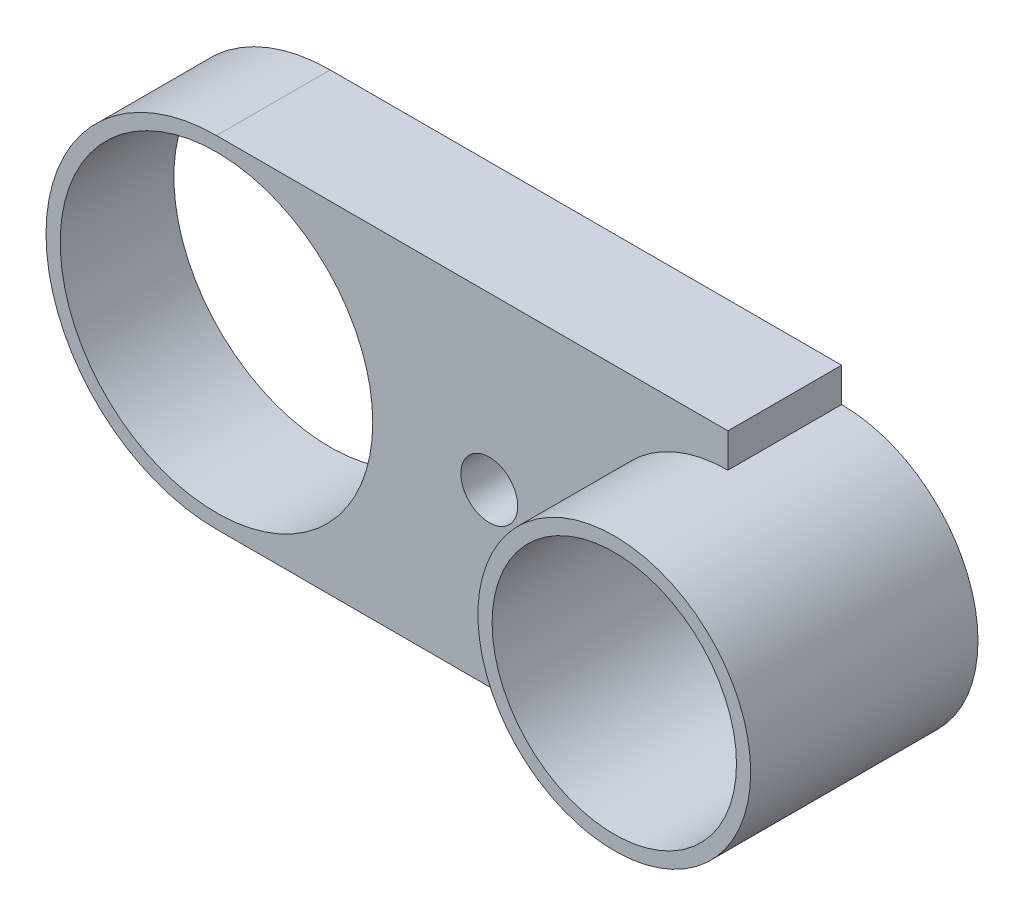
ISO-10303-21;
HEADER;
FILE_DESCRIPTION(('STEP AP214'),'2;1');
FILE_NAME('part.step','',(''),(''),'','','');
FILE_SCHEMA(('AUTOMOTIVE_DESIGN { 1 0 10303 214 1 1 1 1 }'));
ENDSEC;
DATA;
#1=APPLICATION_CONTEXT('core data for automotive mechanical design processes');
#2=APPLICATION_PROTOCOL_DEFINITION('international standard','automotive_design',2000,#1);
#3=PRODUCT_CONTEXT('',#1,'mechanical');
#4=PRODUCT('Part','Part','',(#3));
#5=PRODUCT_RELATED_PRODUCT_CATEGORY('part','',(#4));
#6=PRODUCT_DEFINITION_FORMATION('','',#4);
#7=PRODUCT_DEFINITION_CONTEXT('part definition',#1,'design');
#8=PRODUCT_DEFINITION('design','',#6,#7);
#9=PRODUCT_DEFINITION_SHAPE('','',#8);
#10=(LENGTH_UNIT() NAMED_UNIT(*) SI_UNIT(.MILLI.,.METRE.));
#11=(NAMED_UNIT(*) PLANE_ANGLE_UNIT() SI_UNIT($,.RADIAN.));
#12=(NAMED_UNIT(*) SI_UNIT($,.STERADIAN.) SOLID_ANGLE_UNIT());
#13=UNCERTAINTY_MEASURE_WITH_UNIT(LENGTH_MEASURE(1.E-05),#10,'distance_accuracy_value','');
#14=(GEOMETRIC_REPRESENTATION_CONTEXT(3) GLOBAL_UNCERTAINTY_ASSIGNED_CONTEXT((#13)) GLOBAL_UNIT_ASSIGNED_CONTEXT((#10,
#11,#12)) REPRESENTATION_CONTEXT('',''));
#15=CARTESIAN_POINT('',(0.,0.,0.));
#16=DIRECTION('',(0.,0.,1.));
#17=DIRECTION('',(1.,0.,0.));
#18=AXIS2_PLACEMENT_3D('',#15,#16,#17);
#19=CARTESIAN_POINT('',(0.,0.,20.));
#20=DIRECTION('',(0.,0.,-1.));
#21=DIRECTION('',(-1.,0.,0.));
#22=AXIS2_PLACEMENT_3D('',#19,#20,#21);
#23=CYLINDRICAL_SURFACE('',#22,30.);
#24=CARTESIAN_POINT('',(0.,0.,20.));
#25=DIRECTION('',(0.,0.,1.));
#26=DIRECTION('',(1.,0.,0.));
#27=AXIS2_PLACEMENT_3D('',#24,#25,#26);
#28=CIRCLE('',#27,30.);
#29=CARTESIAN_POINT('',(0.,30.,20.));
#30=VERTEX_POINT('',#29);
#31=CARTESIAN_POINT('',(0.,-30.,20.));
#32=VERTEX_POINT('',#31);
#33=EDGE_CURVE('E11',#30,#32,#28,.T.);
#34=ORIENTED_EDGE('',*,*,#33,.F.);
#35=DIRECTION('',(0.,0.,1.));
#36=VECTOR('',#35,1.);
#37=CARTESIAN_POINT('',(0.,30.,0.));
#38=LINE('',#37,#36);
#39=CARTESIAN_POINT('',(0.,30.,0.));
#40=VERTEX_POINT('',#39);
#41=EDGE_CURVE('E143',#40,#30,#38,.T.);
#42=ORIENTED_EDGE('',*,*,#41,.F.);
#43=CARTESIAN_POINT('',(0.,0.,0.));
#44=DIRECTION('',(0.,0.,1.));
#45=DIRECTION('',(1.,0.,0.));
#46=AXIS2_PLACEMENT_3D('',#43,#44,#45);
#47=CIRCLE('',#46,30.);
#48=CARTESIAN_POINT('',(0.,-30.,0.));
#49=VERTEX_POINT('',#48);
#50=EDGE_CURVE('E37',#40,#49,#47,.T.);
#51=ORIENTED_EDGE('',*,*,#50,.T.);
#52=DIRECTION('',(0.,0.,1.));
#53=VECTOR('',#52,1.);
#54=CARTESIAN_POINT('',(0.,-30.,0.));
#55=LINE('',#54,#53);
#56=EDGE_CURVE('E48',#49,#32,#55,.T.);
#57=ORIENTED_EDGE('',*,*,#56,.T.);
#58=EDGE_LOOP('',(#34,#42,#51,#57));
#59=FACE_BOUND('',#58,.T.);
#60=ADVANCED_FACE('F34',(#59),#23,.T.);
#61=CARTESIAN_POINT('',(0.,0.,20.));
#62=DIRECTION('',(0.,0.,1.));
#63=DIRECTION('',(1.,0.,0.));
#64=AXIS2_PLACEMENT_3D('',#61,#62,#63);
#65=PLANE('',#64);
#66=CARTESIAN_POINT('',(90.,0.,20.));
#67=DIRECTION('',(0.,0.,1.));
#68=DIRECTION('',(1.,0.,0.));
#69=AXIS2_PLACEMENT_3D('',#66,#67,#68);
#70=CIRCLE('',#69,24.);
#71=CARTESIAN_POINT('',(90.,24.,20.));
#72=VERTEX_POINT('',#71);
#73=CARTESIAN_POINT('',(90.,-24.,20.));
#74=VERTEX_POINT('',#73);
#75=EDGE_CURVE('E101',#72,#74,#70,.T.);
#76=ORIENTED_EDGE('',*,*,#75,.F.);
#77=DIRECTION('',(0.,1.,0.));
#78=VECTOR('',#77,1.);
#79=CARTESIAN_POINT('',(90.,30.,20.));
#80=LINE('',#79,#78);
#81=CARTESIAN_POINT('',(90.,30.,20.));
#82=VERTEX_POINT('',#81);
#83=EDGE_CURVE('E82',#72,#82,#80,.T.);
#84=ORIENTED_EDGE('',*,*,#83,.T.);
#85=DIRECTION('',(-1.,0.,0.));
#86=VECTOR('',#85,1.);
#87=CARTESIAN_POINT('',(0.,30.,20.));
#88=LINE('',#87,#86);
#89=EDGE_CURVE('E93',#82,#30,#88,.T.);
#90=ORIENTED_EDGE('',*,*,#89,.T.);
#91=ORIENTED_EDGE('',*,*,#33,.T.);
#92=DIRECTION('',(1.,0.,0.));
#93=VECTOR('',#92,1.);
#94=CARTESIAN_POINT('',(0.,-30.,20.));
#95=LINE('',#94,#93);
#96=CARTESIAN_POINT('',(90.,-30.,20.));
#97=VERTEX_POINT('',#96);
#98=EDGE_CURVE('E125',#32,#97,#95,.T.);
#99=ORIENTED_EDGE('',*,*,#98,.T.);
#100=DIRECTION('',(0.,1.,0.));
#101=VECTOR('',#100,1.);
#102=CARTESIAN_POINT('',(90.,-30.,20.));
#103=LINE('',#102,#101);
#104=EDGE_CURVE('E94',#97,#74,#103,.T.);
#105=ORIENTED_EDGE('',*,*,#104,.T.);
#106=EDGE_LOOP('',(#76,#84,#90,#91,#99,#105));
#107=FACE_BOUND('',#106,.T.);
#108=CARTESIAN_POINT('',(48.,0.,20.));
#109=DIRECTION('',(0.,0.,1.));
#110=DIRECTION('',(1.,0.,0.));
#111=AXIS2_PLACEMENT_3D('',#108,#109,#110);
#112=CIRCLE('',#111,5.);
#113=CARTESIAN_POINT('',(53.,0.,20.));
#114=VERTEX_POINT('',#113);
#115=EDGE_CURVE('E115',#114,#114,#112,.T.);
#116=ORIENTED_EDGE('',*,*,#115,.F.);
#117=EDGE_LOOP('',(#116));
#118=FACE_BOUND('',#117,.T.);
#119=CARTESIAN_POINT('',(0.,0.,20.));
#120=DIRECTION('',(0.,0.,1.));
#121=DIRECTION('',(1.,0.,0.));
#122=AXIS2_PLACEMENT_3D('',#119,#120,#121);
#123=CIRCLE('',#122,27.5);
#124=CARTESIAN_POINT('',(27.5,0.,20.));
#125=VERTEX_POINT('',#124);
#126=EDGE_CURVE('E145',#125,#125,#123,.T.);
#127=ORIENTED_EDGE('',*,*,#126,.F.);
#128=EDGE_LOOP('',(#127));
#129=FACE_BOUND('',#128,.T.);
#130=ADVANCED_FACE('F107',(#107,#118,#129),#65,.T.);
#131=CARTESIAN_POINT('',(0.,0.,0.));
#132=DIRECTION('',(0.,0.,1.));
#133=DIRECTION('',(1.,0.,0.));
#134=AXIS2_PLACEMENT_3D('',#131,#132,#133);
#135=PLANE('',#134);
#136=CARTESIAN_POINT('',(48.,0.,0.));
#137=DIRECTION('',(0.,0.,1.));
#138=DIRECTION('',(1.,0.,0.));
#139=AXIS2_PLACEMENT_3D('',#136,#137,#138);
#140=CIRCLE('',#139,5.);
#141=CARTESIAN_POINT('',(53.,0.,0.));
#142=VERTEX_POINT('',#141);
#143=EDGE_CURVE('E122',#142,#142,#140,.T.);
#144=ORIENTED_EDGE('',*,*,#143,.T.);
#145=EDGE_LOOP('',(#144));
#146=FACE_BOUND('',#145,.T.);
#147=CARTESIAN_POINT('',(0.,0.,0.));
#148=DIRECTION('',(0.,0.,1.));
#149=DIRECTION('',(1.,0.,0.));
#150=AXIS2_PLACEMENT_3D('',#147,#148,#149);
#151=CIRCLE('',#150,27.5);
#152=CARTESIAN_POINT('',(27.5,0.,0.));
#153=VERTEX_POINT('',#152);
#154=EDGE_CURVE('E151',#153,#153,#151,.T.);
#155=ORIENTED_EDGE('',*,*,#154,.T.);
#156=EDGE_LOOP('',(#155));
#157=FACE_BOUND('',#156,.T.);
#158=DIRECTION('',(0.,1.,0.));
#159=VECTOR('',#158,1.);
#160=CARTESIAN_POINT('',(90.,30.,0.));
#161=LINE('',#160,#159);
#162=CARTESIAN_POINT('',(90.,24.,0.));
#163=VERTEX_POINT('',#162);
#164=CARTESIAN_POINT('',(90.,30.,0.));
#165=VERTEX_POINT('',#164);
#166=EDGE_CURVE('E135',#163,#165,#161,.T.);
#167=ORIENTED_EDGE('',*,*,#166,.F.);
#168=CARTESIAN_POINT('',(90.,0.,0.));
#169=DIRECTION('',(0.,0.,1.));
#170=DIRECTION('',(1.,0.,0.));
#171=AXIS2_PLACEMENT_3D('',#168,#169,#170);
#172=CIRCLE('',#171,24.);
#173=CARTESIAN_POINT('',(90.,-24.,0.));
#174=VERTEX_POINT('',#173);
#175=EDGE_CURVE('E103',#174,#163,#172,.T.);
#176=ORIENTED_EDGE('',*,*,#175,.F.);
#177=DIRECTION('',(0.,1.,0.));
#178=VECTOR('',#177,1.);
#179=CARTESIAN_POINT('',(90.,-30.,0.));
#180=LINE('',#179,#178);
#181=CARTESIAN_POINT('',(90.,-30.,0.));
#182=VERTEX_POINT('',#181);
#183=EDGE_CURVE('E131',#182,#174,#180,.T.);
#184=ORIENTED_EDGE('',*,*,#183,.F.);
#185=DIRECTION('',(1.,0.,0.));
#186=VECTOR('',#185,1.);
#187=CARTESIAN_POINT('',(0.,-30.,0.));
#188=LINE('',#187,#186);
#189=EDGE_CURVE('E128',#49,#182,#188,.T.);
#190=ORIENTED_EDGE('',*,*,#189,.F.);
#191=ORIENTED_EDGE('',*,*,#50,.F.);
#192=DIRECTION('',(-1.,0.,0.));
#193=VECTOR('',#192,1.);
#194=CARTESIAN_POINT('',(0.,30.,0.));
#195=LINE('',#194,#193);
#196=EDGE_CURVE('E137',#165,#40,#195,.T.);
#197=ORIENTED_EDGE('',*,*,#196,.F.);
#198=EDGE_LOOP('',(#167,#176,#184,#190,#191,#197));
#199=FACE_BOUND('',#198,.T.);
#200=ADVANCED_FACE('F160',(#146,#157,#199),#135,.F.);
#201=CARTESIAN_POINT('',(0.,0.,0.));
#202=DIRECTION('',(0.,0.,1.));
#203=DIRECTION('',(1.,0.,0.));
#204=AXIS2_PLACEMENT_3D('',#201,#202,#203);
#205=CYLINDRICAL_SURFACE('',#204,27.5);
#206=ORIENTED_EDGE('',*,*,#154,.F.);
#207=EDGE_LOOP('',(#206));
#208=FACE_BOUND('',#207,.T.);
#209=ORIENTED_EDGE('',*,*,#126,.T.);
#210=EDGE_LOOP('',(#209));
#211=FACE_BOUND('',#210,.T.);
#212=ADVANCED_FACE('F157',(#208,#211),#205,.F.);
#213=CARTESIAN_POINT('',(0.,30.,0.));
#214=DIRECTION('',(0.,1.,0.));
#215=DIRECTION('',(0.,0.,1.));
#216=AXIS2_PLACEMENT_3D('',#213,#214,#215);
#217=PLANE('',#216);
#218=ORIENTED_EDGE('',*,*,#89,.F.);
#219=DIRECTION('',(0.,0.,1.));
#220=VECTOR('',#219,1.);
#221=CARTESIAN_POINT('',(90.,30.,0.));
#222=LINE('',#221,#220);
#223=EDGE_CURVE('E88',#165,#82,#222,.T.);
#224=ORIENTED_EDGE('',*,*,#223,.F.);
#225=ORIENTED_EDGE('',*,*,#196,.T.);
#226=ORIENTED_EDGE('',*,*,#41,.T.);
#227=EDGE_LOOP('',(#218,#224,#225,#226));
#228=FACE_BOUND('',#227,.T.);
#229=ADVANCED_FACE('F170',(#228),#217,.T.);
#230=CARTESIAN_POINT('',(90.,30.,0.));
#231=DIRECTION('',(1.,0.,0.));
#232=DIRECTION('',(0.,0.,-1.));
#233=AXIS2_PLACEMENT_3D('',#230,#231,#232);
#234=PLANE('',#233);
#235=ORIENTED_EDGE('',*,*,#83,.F.);
#236=DIRECTION('',(0.,0.,1.));
#237=VECTOR('',#236,1.);
#238=CARTESIAN_POINT('',(90.,24.,0.));
#239=LINE('',#238,#237);
#240=EDGE_CURVE('E86',#163,#72,#239,.T.);
#241=ORIENTED_EDGE('',*,*,#240,.F.);
#242=ORIENTED_EDGE('',*,*,#166,.T.);
#243=ORIENTED_EDGE('',*,*,#223,.T.);
#244=EDGE_LOOP('',(#235,#241,#242,#243));
#245=FACE_BOUND('',#244,.T.);
#246=ADVANCED_FACE('F84',(#245),#234,.T.);
#247=CARTESIAN_POINT('',(90.,0.,0.));
#248=DIRECTION('',(0.,0.,1.));
#249=DIRECTION('',(1.,0.,0.));
#250=AXIS2_PLACEMENT_3D('',#247,#248,#249);
#251=CYLINDRICAL_SURFACE('',#250,24.);
#252=ORIENTED_EDGE('',*,*,#240,.T.);
#253=ORIENTED_EDGE('',*,*,#75,.T.);
#254=DIRECTION('',(0.,0.,1.));
#255=VECTOR('',#254,1.);
#256=CARTESIAN_POINT('',(90.,-24.,0.));
#257=LINE('',#256,#255);
#258=EDGE_CURVE('E104',#174,#74,#257,.T.);
#259=ORIENTED_EDGE('',*,*,#258,.F.);
#260=ORIENTED_EDGE('',*,*,#175,.T.);
#261=EDGE_LOOP('',(#252,#253,#259,#260));
#262=FACE_BOUND('',#261,.T.);
#263=CARTESIAN_POINT('',(90.,0.,40.));
#264=DIRECTION('',(0.,0.,1.));
#265=DIRECTION('',(1.,0.,0.));
#266=AXIS2_PLACEMENT_3D('',#263,#264,#265);
#267=CIRCLE('',#266,24.);
#268=CARTESIAN_POINT('',(114.,0.,40.));
#269=VERTEX_POINT('',#268);
#270=EDGE_CURVE('E111',#269,#269,#267,.T.);
#271=ORIENTED_EDGE('',*,*,#270,.F.);
#272=EDGE_LOOP('',(#271));
#273=FACE_BOUND('',#272,.T.);
#274=ADVANCED_FACE('F99',(#262,#273),#251,.T.);
#275=CARTESIAN_POINT('',(90.,-30.,0.));
#276=DIRECTION('',(1.,0.,0.));
#277=DIRECTION('',(0.,0.,-1.));
#278=AXIS2_PLACEMENT_3D('',#275,#276,#277);
#279=PLANE('',#278);
#280=ORIENTED_EDGE('',*,*,#104,.F.);
#281=DIRECTION('',(0.,0.,1.));
#282=VECTOR('',#281,1.);
#283=CARTESIAN_POINT('',(90.,-30.,0.));
#284=LINE('',#283,#282);
#285=EDGE_CURVE('E148',#182,#97,#284,.T.);
#286=ORIENTED_EDGE('',*,*,#285,.F.);
#287=ORIENTED_EDGE('',*,*,#183,.T.);
#288=ORIENTED_EDGE('',*,*,#258,.T.);
#289=EDGE_LOOP('',(#280,#286,#287,#288));
#290=FACE_BOUND('',#289,.T.);
#291=ADVANCED_FACE('F176',(#290),#279,.T.);
#292=CARTESIAN_POINT('',(0.,-30.,0.));
#293=DIRECTION('',(0.,-1.,0.));
#294=DIRECTION('',(0.,0.,-1.));
#295=AXIS2_PLACEMENT_3D('',#292,#293,#294);
#296=PLANE('',#295);
#297=ORIENTED_EDGE('',*,*,#98,.F.);
#298=ORIENTED_EDGE('',*,*,#56,.F.);
#299=ORIENTED_EDGE('',*,*,#189,.T.);
#300=ORIENTED_EDGE('',*,*,#285,.T.);
#301=EDGE_LOOP('',(#297,#298,#299,#300));
#302=FACE_BOUND('',#301,.T.);
#303=ADVANCED_FACE('F172',(#302),#296,.T.);
#304=CARTESIAN_POINT('',(48.,0.,0.));
#305=DIRECTION('',(0.,0.,1.));
#306=DIRECTION('',(1.,0.,0.));
#307=AXIS2_PLACEMENT_3D('',#304,#305,#306);
#308=CYLINDRICAL_SURFACE('',#307,5.);
#309=ORIENTED_EDGE('',*,*,#143,.F.);
#310=EDGE_LOOP('',(#309));
#311=FACE_BOUND('',#310,.T.);
#312=ORIENTED_EDGE('',*,*,#115,.T.);
#313=EDGE_LOOP('',(#312));
#314=FACE_BOUND('',#313,.T.);
#315=ADVANCED_FACE('F175',(#311,#314),#308,.F.);
#316=CARTESIAN_POINT('',(90.,0.,40.));
#317=DIRECTION('',(0.,0.,1.));
#318=DIRECTION('',(1.,0.,0.));
#319=AXIS2_PLACEMENT_3D('',#316,#317,#318);
#320=PLANE('',#319);
#321=CARTESIAN_POINT('',(90.,0.,40.));
#322=DIRECTION('',(0.,0.,1.));
#323=DIRECTION('',(1.,0.,0.));
#324=AXIS2_PLACEMENT_3D('',#321,#322,#323);
#325=CIRCLE('',#324,21.5);
#326=CARTESIAN_POINT('',(111.5,0.,40.));
#327=VERTEX_POINT('',#326);
#328=EDGE_CURVE('E118',#327,#327,#325,.T.);
#329=ORIENTED_EDGE('',*,*,#328,.F.);
#330=EDGE_LOOP('',(#329));
#331=FACE_BOUND('',#330,.T.);
#332=ORIENTED_EDGE('',*,*,#270,.T.);
#333=EDGE_LOOP('',(#332));
#334=FACE_BOUND('',#333,.T.);
#335=ADVANCED_FACE('F190',(#331,#334),#320,.T.);
#336=CARTESIAN_POINT('',(90.,0.,4.99999999999999));
#337=DIRECTION('',(0.,0.,1.));
#338=DIRECTION('',(1.,0.,0.));
#339=AXIS2_PLACEMENT_3D('',#336,#337,#338);
#340=CYLINDRICAL_SURFACE('',#339,21.5);
#341=CARTESIAN_POINT('',(90.,0.,4.99999999999999));
#342=DIRECTION('',(0.,0.,1.));
#343=DIRECTION('',(1.,0.,0.));
#344=AXIS2_PLACEMENT_3D('',#341,#342,#343);
#345=CIRCLE('',#344,21.5);
#346=CARTESIAN_POINT('',(111.5,0.,4.99999999999999));
#347=VERTEX_POINT('',#346);
#348=EDGE_CURVE('E112',#347,#347,#345,.T.);
#349=ORIENTED_EDGE('',*,*,#348,.F.);
#350=EDGE_LOOP('',(#349));
#351=FACE_BOUND('',#350,.T.);
#352=ORIENTED_EDGE('',*,*,#328,.T.);
#353=EDGE_LOOP('',(#352));
#354=FACE_BOUND('',#353,.T.);
#355=ADVANCED_FACE('F194',(#351,#354),#340,.F.);
#356=CARTESIAN_POINT('',(90.,0.,4.99999999999999));
#357=DIRECTION('',(0.,0.,1.));
#358=DIRECTION('',(1.,0.,0.));
#359=AXIS2_PLACEMENT_3D('',#356,#357,#358);
#360=PLANE('',#359);
#361=ORIENTED_EDGE('',*,*,#348,.T.);
#362=EDGE_LOOP('',(#361));
#363=FACE_BOUND('',#362,.T.);
#364=ADVANCED_FACE('F198',(#363),#360,.T.);
#365=CLOSED_SHELL('',(#60,#130,#200,#212,#229,#246,#274,#291,#303,#315,#335,#355,#364));
#366=MANIFOLD_SOLID_BREP('B2',#365);
#367=ADVANCED_BREP_SHAPE_REPRESENTATION('',(#18,#366),#14);
#368=SHAPE_DEFINITION_REPRESENTATION(#9,#367);
ENDSEC;
END-ISO-10303-21;
